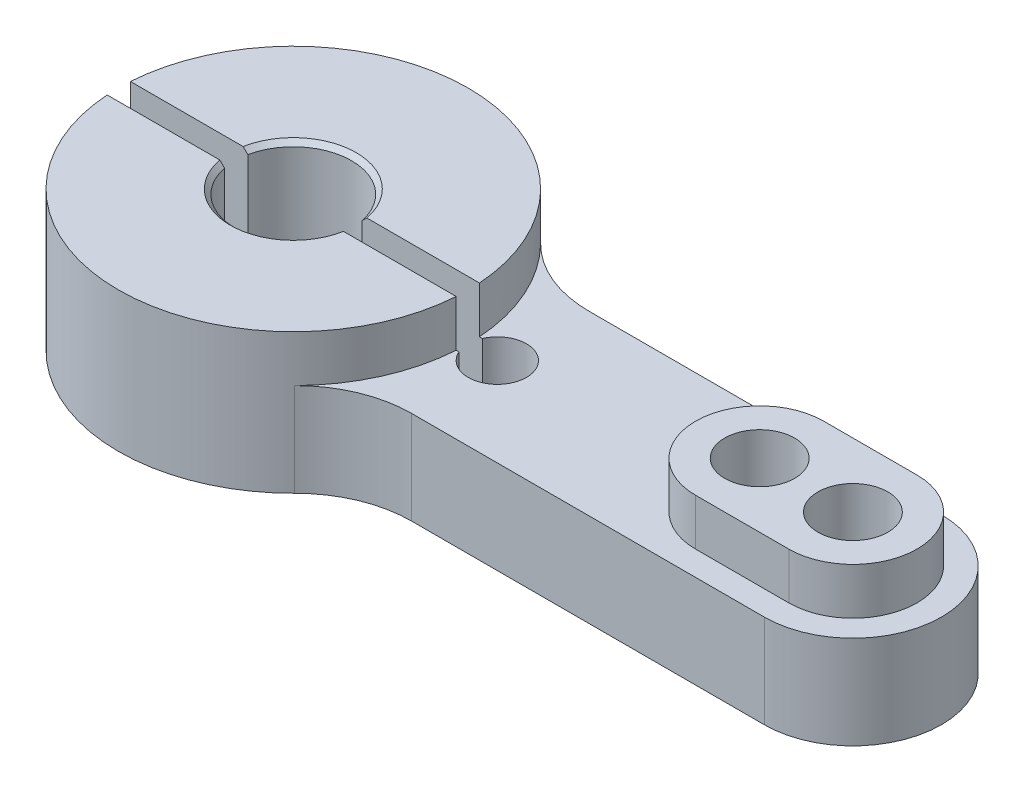
ISO-10303-21;
HEADER;
FILE_DESCRIPTION(('STEP AP214'),'2;1');
FILE_NAME('part.step','',(''),(''),'','','');
FILE_SCHEMA(('AUTOMOTIVE_DESIGN { 1 0 10303 214 1 1 1 1 }'));
ENDSEC;
DATA;
#1=APPLICATION_CONTEXT('core data for automotive mechanical design processes');
#2=APPLICATION_PROTOCOL_DEFINITION('international standard','automotive_design',2000,#1);
#3=PRODUCT_CONTEXT('',#1,'mechanical');
#4=PRODUCT('Part','Part','',(#3));
#5=PRODUCT_RELATED_PRODUCT_CATEGORY('part','',(#4));
#6=PRODUCT_DEFINITION_FORMATION('','',#4);
#7=PRODUCT_DEFINITION_CONTEXT('part definition',#1,'design');
#8=PRODUCT_DEFINITION('design','',#6,#7);
#9=PRODUCT_DEFINITION_SHAPE('','',#8);
#10=(LENGTH_UNIT() NAMED_UNIT(*) SI_UNIT(.MILLI.,.METRE.));
#11=(NAMED_UNIT(*) PLANE_ANGLE_UNIT() SI_UNIT($,.RADIAN.));
#12=(NAMED_UNIT(*) SI_UNIT($,.STERADIAN.) SOLID_ANGLE_UNIT());
#13=UNCERTAINTY_MEASURE_WITH_UNIT(LENGTH_MEASURE(1.E-05),#10,'distance_accuracy_value','');
#14=(GEOMETRIC_REPRESENTATION_CONTEXT(3) GLOBAL_UNCERTAINTY_ASSIGNED_CONTEXT((#13)) GLOBAL_UNIT_ASSIGNED_CONTEXT((#10,
#11,#12)) REPRESENTATION_CONTEXT('',''));
#15=CARTESIAN_POINT('',(0.,0.,0.));
#16=DIRECTION('',(0.,0.,1.));
#17=DIRECTION('',(1.,0.,0.));
#18=AXIS2_PLACEMENT_3D('',#15,#16,#17);
#19=CARTESIAN_POINT('',(8.87749964798648,4.,8.8));
#20=DIRECTION('',(0.,-1.,0.));
#21=DIRECTION('',(0.,0.,-1.));
#22=AXIS2_PLACEMENT_3D('',#19,#20,#21);
#23=CYLINDRICAL_SURFACE('',#22,5.);
#24=DIRECTION('',(0.,-1.,0.));
#25=VECTOR('',#24,1.);
#26=CARTESIAN_POINT('',(5.32649978879189,4.,5.28));
#27=LINE('',#26,#25);
#28=CARTESIAN_POINT('',(5.32649978879188,0.,5.28000000000001));
#29=VERTEX_POINT('',#28);
#30=CARTESIAN_POINT('',(5.32649978879189,4.,5.28));
#31=VERTEX_POINT('',#30);
#32=EDGE_CURVE('E443',#29,#31,#27,.F.);
#33=ORIENTED_EDGE('',*,*,#32,.F.);
#34=CARTESIAN_POINT('',(8.87749964798648,0.,8.8));
#35=DIRECTION('',(0.,1.,0.));
#36=DIRECTION('',(0.,0.,1.));
#37=AXIS2_PLACEMENT_3D('',#34,#35,#36);
#38=CIRCLE('',#37,5.);
#39=CARTESIAN_POINT('',(8.87749964798648,0.,3.8));
#40=VERTEX_POINT('',#39);
#41=EDGE_CURVE('E449',#29,#40,#38,.F.);
#42=ORIENTED_EDGE('',*,*,#41,.T.);
#43=DIRECTION('',(0.,-1.,0.));
#44=VECTOR('',#43,1.);
#45=CARTESIAN_POINT('',(8.87749964798648,4.,3.8));
#46=LINE('',#45,#44);
#47=CARTESIAN_POINT('',(8.87749964798648,4.,3.8));
#48=VERTEX_POINT('',#47);
#49=EDGE_CURVE('E446',#48,#40,#46,.T.);
#50=ORIENTED_EDGE('',*,*,#49,.F.);
#51=CARTESIAN_POINT('',(8.87749964798648,4.,8.8));
#52=DIRECTION('',(0.,1.,0.));
#53=DIRECTION('',(0.,0.,1.));
#54=AXIS2_PLACEMENT_3D('',#51,#52,#53);
#55=CIRCLE('',#54,5.);
#56=EDGE_CURVE('E451',#48,#31,#55,.T.);
#57=ORIENTED_EDGE('',*,*,#56,.T.);
#58=EDGE_LOOP('',(#33,#42,#50,#57));
#59=FACE_BOUND('',#58,.T.);
#60=ADVANCED_FACE('F36',(#59),#23,.F.);
#61=CARTESIAN_POINT('',(8.87749964798648,4.,-8.8));
#62=DIRECTION('',(0.,-1.,0.));
#63=DIRECTION('',(0.,0.,-1.));
#64=AXIS2_PLACEMENT_3D('',#61,#62,#63);
#65=CYLINDRICAL_SURFACE('',#64,5.);
#66=DIRECTION('',(0.,-1.,0.));
#67=VECTOR('',#66,1.);
#68=CARTESIAN_POINT('',(5.32649978879189,4.,-5.28));
#69=LINE('',#68,#67);
#70=CARTESIAN_POINT('',(5.32649978879189,4.,-5.28));
#71=VERTEX_POINT('',#70);
#72=CARTESIAN_POINT('',(5.32649978879189,0.,-5.28));
#73=VERTEX_POINT('',#72);
#74=EDGE_CURVE('E245',#71,#73,#69,.T.);
#75=ORIENTED_EDGE('',*,*,#74,.F.);
#76=CARTESIAN_POINT('',(8.87749964798648,4.,-8.8));
#77=DIRECTION('',(0.,1.,0.));
#78=DIRECTION('',(0.,0.,1.));
#79=AXIS2_PLACEMENT_3D('',#76,#77,#78);
#80=CIRCLE('',#79,5.);
#81=CARTESIAN_POINT('',(8.87749964798648,4.,-3.8));
#82=VERTEX_POINT('',#81);
#83=EDGE_CURVE('E439',#71,#82,#80,.T.);
#84=ORIENTED_EDGE('',*,*,#83,.T.);
#85=DIRECTION('',(0.,1.,0.));
#86=VECTOR('',#85,1.);
#87=CARTESIAN_POINT('',(8.87749964798648,4.,-3.8));
#88=LINE('',#87,#86);
#89=CARTESIAN_POINT('',(8.87749964798648,0.,-3.8));
#90=VERTEX_POINT('',#89);
#91=EDGE_CURVE('E436',#90,#82,#88,.T.);
#92=ORIENTED_EDGE('',*,*,#91,.F.);
#93=CARTESIAN_POINT('',(8.87749964798648,0.,-8.8));
#94=DIRECTION('',(0.,1.,0.));
#95=DIRECTION('',(0.,0.,1.));
#96=AXIS2_PLACEMENT_3D('',#93,#94,#95);
#97=CIRCLE('',#96,5.);
#98=EDGE_CURVE('E441',#90,#73,#97,.F.);
#99=ORIENTED_EDGE('',*,*,#98,.T.);
#100=EDGE_LOOP('',(#75,#84,#92,#99));
#101=FACE_BOUND('',#100,.T.);
#102=ADVANCED_FACE('F563',(#101),#65,.F.);
#103=CARTESIAN_POINT('',(0.,6.,0.));
#104=DIRECTION('',(0.,-1.,0.));
#105=DIRECTION('',(0.,0.,-1.));
#106=AXIS2_PLACEMENT_3D('',#103,#104,#105);
#107=CYLINDRICAL_SURFACE('',#106,1.);
#108=CARTESIAN_POINT('',(0.,1.,0.));
#109=DIRECTION('',(0.,-1.,0.));
#110=DIRECTION('',(0.,0.,-1.));
#111=AXIS2_PLACEMENT_3D('',#108,#109,#110);
#112=CIRCLE('',#111,1.);
#113=CARTESIAN_POINT('',(0.866025403784439,1.,-0.5));
#114=VERTEX_POINT('',#113);
#115=CARTESIAN_POINT('',(-0.866025403784439,1.,-0.5));
#116=VERTEX_POINT('',#115);
#117=EDGE_CURVE('E421',#114,#116,#112,.F.);
#118=ORIENTED_EDGE('',*,*,#117,.F.);
#119=DIRECTION('',(0.,-1.,0.));
#120=VECTOR('',#119,1.);
#121=CARTESIAN_POINT('',(0.866025403784439,6.,-0.5));
#122=LINE('',#121,#120);
#123=CARTESIAN_POINT('',(0.866025403784439,2.,-0.5));
#124=VERTEX_POINT('',#123);
#125=EDGE_CURVE('E317',#114,#124,#122,.F.);
#126=ORIENTED_EDGE('',*,*,#125,.T.);
#127=CARTESIAN_POINT('',(0.,2.,0.));
#128=DIRECTION('',(0.,1.,0.));
#129=DIRECTION('',(0.,0.,1.));
#130=AXIS2_PLACEMENT_3D('',#127,#128,#129);
#131=CIRCLE('',#130,1.);
#132=CARTESIAN_POINT('',(-0.866025403784439,2.,-0.5));
#133=VERTEX_POINT('',#132);
#134=EDGE_CURVE('E339',#124,#133,#131,.T.);
#135=ORIENTED_EDGE('',*,*,#134,.T.);
#136=DIRECTION('',(0.,-1.,0.));
#137=VECTOR('',#136,1.);
#138=CARTESIAN_POINT('',(-0.866025403784439,6.,-0.5));
#139=LINE('',#138,#137);
#140=EDGE_CURVE('E307',#133,#116,#139,.T.);
#141=ORIENTED_EDGE('',*,*,#140,.T.);
#142=EDGE_LOOP('',(#118,#126,#135,#141));
#143=FACE_BOUND('',#142,.T.);
#144=ADVANCED_FACE('F565',(#143),#107,.F.);
#145=CARTESIAN_POINT('',(0.,4.,0.));
#146=DIRECTION('',(0.,-1.,0.));
#147=DIRECTION('',(0.,0.,-1.));
#148=AXIS2_PLACEMENT_3D('',#145,#146,#147);
#149=CYLINDRICAL_SURFACE('',#148,7.5);
#150=CARTESIAN_POINT('',(0.,4.,0.));
#151=DIRECTION('',(0.,1.,0.));
#152=DIRECTION('',(0.,0.,1.));
#153=AXIS2_PLACEMENT_3D('',#150,#151,#152);
#154=CIRCLE('',#153,7.5);
#155=CARTESIAN_POINT('',(7.48331477354788,4.,-0.5));
#156=VERTEX_POINT('',#155);
#157=EDGE_CURVE('E384',#156,#71,#154,.T.);
#158=ORIENTED_EDGE('',*,*,#157,.T.);
#159=ORIENTED_EDGE('',*,*,#74,.T.);
#160=CARTESIAN_POINT('',(0.,0.,0.));
#161=DIRECTION('',(0.,1.,0.));
#162=DIRECTION('',(0.,0.,1.));
#163=AXIS2_PLACEMENT_3D('',#160,#161,#162);
#164=CIRCLE('',#163,7.5);
#165=CARTESIAN_POINT('',(-7.48331477354788,0.,-0.5));
#166=VERTEX_POINT('',#165);
#167=EDGE_CURVE('E238',#73,#166,#164,.T.);
#168=ORIENTED_EDGE('',*,*,#167,.T.);
#169=DIRECTION('',(0.,-1.,0.));
#170=VECTOR('',#169,1.);
#171=CARTESIAN_POINT('',(-7.48331477354788,4.,-0.5));
#172=LINE('',#171,#170);
#173=CARTESIAN_POINT('',(-7.48331477354788,6.,-0.5));
#174=VERTEX_POINT('',#173);
#175=EDGE_CURVE('E242',#166,#174,#172,.F.);
#176=ORIENTED_EDGE('',*,*,#175,.T.);
#177=CARTESIAN_POINT('',(0.,6.,0.));
#178=DIRECTION('',(0.,1.,0.));
#179=DIRECTION('',(0.,0.,1.));
#180=AXIS2_PLACEMENT_3D('',#177,#178,#179);
#181=CIRCLE('',#180,7.5);
#182=CARTESIAN_POINT('',(7.48331477354788,6.,-0.5));
#183=VERTEX_POINT('',#182);
#184=EDGE_CURVE('E381',#183,#174,#181,.T.);
#185=ORIENTED_EDGE('',*,*,#184,.F.);
#186=DIRECTION('',(0.,-1.,0.));
#187=VECTOR('',#186,1.);
#188=CARTESIAN_POINT('',(7.48331477354788,4.,-0.5));
#189=LINE('',#188,#187);
#190=EDGE_CURVE('E259',#183,#156,#189,.T.);
#191=ORIENTED_EDGE('',*,*,#190,.T.);
#192=EDGE_LOOP('',(#158,#159,#168,#176,#185,#191));
#193=FACE_BOUND('',#192,.T.);
#194=ADVANCED_FACE('F240',(#193),#149,.T.);
#195=CARTESIAN_POINT('',(0.,6.,0.));
#196=DIRECTION('',(0.,1.,0.));
#197=DIRECTION('',(0.,0.,1.));
#198=AXIS2_PLACEMENT_3D('',#195,#196,#197);
#199=PLANE('',#198);
#200=DIRECTION('',(1.,0.,0.));
#201=VECTOR('',#200,1.);
#202=CARTESIAN_POINT('',(-10.3852260103908,6.,-0.5));
#203=LINE('',#202,#201);
#204=CARTESIAN_POINT('',(-2.65329983228432,6.,-0.5));
#205=VERTEX_POINT('',#204);
#206=EDGE_CURVE('E257',#174,#205,#203,.T.);
#207=ORIENTED_EDGE('',*,*,#206,.T.);
#208=CARTESIAN_POINT('',(0.,6.,0.));
#209=DIRECTION('',(0.,1.,0.));
#210=DIRECTION('',(0.,0.,1.));
#211=AXIS2_PLACEMENT_3D('',#208,#209,#210);
#212=CIRCLE('',#211,2.7);
#213=CARTESIAN_POINT('',(2.65329983228432,6.,-0.5));
#214=VERTEX_POINT('',#213);
#215=EDGE_CURVE('E464',#205,#214,#212,.F.);
#216=ORIENTED_EDGE('',*,*,#215,.T.);
#217=EDGE_CURVE('E540',#214,#183,#203,.T.);
#218=ORIENTED_EDGE('',*,*,#217,.T.);
#219=ORIENTED_EDGE('',*,*,#184,.T.);
#220=EDGE_LOOP('',(#207,#216,#218,#219));
#221=FACE_BOUND('',#220,.T.);
#222=ADVANCED_FACE('F538',(#221),#199,.T.);
#223=CARTESIAN_POINT('',(0.,2.,0.));
#224=DIRECTION('',(0.,1.,0.));
#225=DIRECTION('',(0.,0.,1.));
#226=AXIS2_PLACEMENT_3D('',#223,#224,#225);
#227=CYLINDRICAL_SURFACE('',#226,2.5);
#228=DIRECTION('',(0.,1.,0.));
#229=VECTOR('',#228,1.);
#230=CARTESIAN_POINT('',(2.44948974278318,2.,-0.5));
#231=LINE('',#230,#229);
#232=CARTESIAN_POINT('',(2.44948974278318,2.,-0.5));
#233=VERTEX_POINT('',#232);
#234=CARTESIAN_POINT('',(2.44948974278318,5.8,-0.5));
#235=VERTEX_POINT('',#234);
#236=EDGE_CURVE('E320',#233,#235,#231,.T.);
#237=ORIENTED_EDGE('',*,*,#236,.T.);
#238=CARTESIAN_POINT('',(0.,5.8,0.));
#239=DIRECTION('',(0.,1.,0.));
#240=DIRECTION('',(0.,0.,1.));
#241=AXIS2_PLACEMENT_3D('',#238,#239,#240);
#242=CIRCLE('',#241,2.5);
#243=CARTESIAN_POINT('',(-2.44948974278318,5.8,-0.5));
#244=VERTEX_POINT('',#243);
#245=EDGE_CURVE('E454',#235,#244,#242,.T.);
#246=ORIENTED_EDGE('',*,*,#245,.T.);
#247=DIRECTION('',(0.,1.,0.));
#248=VECTOR('',#247,1.);
#249=CARTESIAN_POINT('',(-2.44948974278318,2.,-0.5));
#250=LINE('',#249,#248);
#251=CARTESIAN_POINT('',(-2.44948974278318,2.,-0.5));
#252=VERTEX_POINT('',#251);
#253=EDGE_CURVE('E314',#244,#252,#250,.F.);
#254=ORIENTED_EDGE('',*,*,#253,.T.);
#255=CARTESIAN_POINT('',(0.,2.,0.));
#256=DIRECTION('',(0.,1.,0.));
#257=DIRECTION('',(0.,0.,1.));
#258=AXIS2_PLACEMENT_3D('',#255,#256,#257);
#259=CIRCLE('',#258,2.5);
#260=EDGE_CURVE('E338',#233,#252,#259,.T.);
#261=ORIENTED_EDGE('',*,*,#260,.F.);
#262=EDGE_LOOP('',(#237,#246,#254,#261));
#263=FACE_BOUND('',#262,.T.);
#264=ADVANCED_FACE('F620',(#263),#227,.F.);
#265=CARTESIAN_POINT('',(0.,2.,0.));
#266=DIRECTION('',(0.,1.,0.));
#267=DIRECTION('',(0.,0.,1.));
#268=AXIS2_PLACEMENT_3D('',#265,#266,#267);
#269=PLANE('',#268);
#270=DIRECTION('',(-1.,0.,0.));
#271=VECTOR('',#270,1.);
#272=CARTESIAN_POINT('',(0.,2.,-0.5));
#273=LINE('',#272,#271);
#274=EDGE_CURVE('E315',#233,#124,#273,.T.);
#275=ORIENTED_EDGE('',*,*,#274,.F.);
#276=ORIENTED_EDGE('',*,*,#260,.T.);
#277=EDGE_CURVE('E311',#133,#252,#273,.T.);
#278=ORIENTED_EDGE('',*,*,#277,.F.);
#279=ORIENTED_EDGE('',*,*,#134,.F.);
#280=EDGE_LOOP('',(#275,#276,#278,#279));
#281=FACE_BOUND('',#280,.T.);
#282=ADVANCED_FACE('F622',(#281),#269,.T.);
#283=CARTESIAN_POINT('',(0.,1.,0.));
#284=DIRECTION('',(0.,-1.,0.));
#285=DIRECTION('',(0.,0.,-1.));
#286=AXIS2_PLACEMENT_3D('',#283,#284,#285);
#287=PLANE('',#286);
#288=DIRECTION('',(1.,0.,0.));
#289=VECTOR('',#288,1.);
#290=CARTESIAN_POINT('',(0.,1.,-0.5));
#291=LINE('',#290,#289);
#292=CARTESIAN_POINT('',(-3.71651718682963,1.,-0.5));
#293=VERTEX_POINT('',#292);
#294=EDGE_CURVE('E305',#293,#116,#291,.T.);
#295=ORIENTED_EDGE('',*,*,#294,.F.);
#296=CARTESIAN_POINT('',(0.,1.,0.));
#297=DIRECTION('',(0.,-1.,0.));
#298=DIRECTION('',(0.,0.,-1.));
#299=AXIS2_PLACEMENT_3D('',#296,#297,#298);
#300=CIRCLE('',#299,3.75);
#301=CARTESIAN_POINT('',(3.71651718682963,1.,-0.5));
#302=VERTEX_POINT('',#301);
#303=EDGE_CURVE('E329',#293,#302,#300,.T.);
#304=ORIENTED_EDGE('',*,*,#303,.T.);
#305=EDGE_CURVE('E308',#114,#302,#291,.T.);
#306=ORIENTED_EDGE('',*,*,#305,.F.);
#307=ORIENTED_EDGE('',*,*,#117,.T.);
#308=EDGE_LOOP('',(#295,#304,#306,#307));
#309=FACE_BOUND('',#308,.T.);
#310=ADVANCED_FACE('F628',(#309),#287,.T.);
#311=CARTESIAN_POINT('',(0.,1.,0.));
#312=DIRECTION('',(0.,-1.,0.));
#313=DIRECTION('',(0.,0.,-1.));
#314=AXIS2_PLACEMENT_3D('',#311,#312,#313);
#315=CYLINDRICAL_SURFACE('',#314,3.75);
#316=CARTESIAN_POINT('',(0.,0.,0.));
#317=DIRECTION('',(0.,-1.,0.));
#318=DIRECTION('',(0.,0.,-1.));
#319=AXIS2_PLACEMENT_3D('',#316,#317,#318);
#320=CIRCLE('',#319,3.75);
#321=CARTESIAN_POINT('',(-3.71651718682963,0.,-0.5));
#322=VERTEX_POINT('',#321);
#323=CARTESIAN_POINT('',(3.71651718682963,0.,-0.5));
#324=VERTEX_POINT('',#323);
#325=EDGE_CURVE('E258',#322,#324,#320,.T.);
#326=ORIENTED_EDGE('',*,*,#325,.T.);
#327=DIRECTION('',(0.,-1.,0.));
#328=VECTOR('',#327,1.);
#329=CARTESIAN_POINT('',(3.71651718682963,1.,-0.5));
#330=LINE('',#329,#328);
#331=EDGE_CURVE('E432',#324,#302,#330,.F.);
#332=ORIENTED_EDGE('',*,*,#331,.T.);
#333=ORIENTED_EDGE('',*,*,#303,.F.);
#334=DIRECTION('',(0.,-1.,0.));
#335=VECTOR('',#334,1.);
#336=CARTESIAN_POINT('',(-3.71651718682963,1.,-0.5));
#337=LINE('',#336,#335);
#338=EDGE_CURVE('E430',#293,#322,#337,.T.);
#339=ORIENTED_EDGE('',*,*,#338,.T.);
#340=EDGE_LOOP('',(#326,#332,#333,#339));
#341=FACE_BOUND('',#340,.T.);
#342=ADVANCED_FACE('F625',(#341),#315,.F.);
#343=CARTESIAN_POINT('',(-0.866025403784439,1.,0.5));
#344=VERTEX_POINT('',#343);
#345=CARTESIAN_POINT('',(0.866025403784439,1.,0.5));
#346=VERTEX_POINT('',#345);
#347=EDGE_CURVE('E420',#344,#346,#112,.F.);
#348=ORIENTED_EDGE('',*,*,#347,.F.);
#349=DIRECTION('',(0.,-1.,0.));
#350=VECTOR('',#349,1.);
#351=CARTESIAN_POINT('',(-0.866025403784439,6.,0.5));
#352=LINE('',#351,#350);
#353=CARTESIAN_POINT('',(-0.866025403784439,2.,0.5));
#354=VERTEX_POINT('',#353);
#355=EDGE_CURVE('E289',#344,#354,#352,.F.);
#356=ORIENTED_EDGE('',*,*,#355,.T.);
#357=CARTESIAN_POINT('',(0.866025403784439,2.,0.5));
#358=VERTEX_POINT('',#357);
#359=EDGE_CURVE('E417',#354,#358,#131,.T.);
#360=ORIENTED_EDGE('',*,*,#359,.T.);
#361=DIRECTION('',(0.,-1.,0.));
#362=VECTOR('',#361,1.);
#363=CARTESIAN_POINT('',(0.866025403784439,6.,0.5));
#364=LINE('',#363,#362);
#365=EDGE_CURVE('E279',#358,#346,#364,.T.);
#366=ORIENTED_EDGE('',*,*,#365,.T.);
#367=EDGE_LOOP('',(#348,#356,#360,#366));
#368=FACE_BOUND('',#367,.T.);
#369=ADVANCED_FACE('F505',(#368),#107,.F.);
#370=CARTESIAN_POINT('',(-7.48331477354788,0.,0.5));
#371=VERTEX_POINT('',#370);
#372=EDGE_CURVE('E249',#371,#29,#164,.T.);
#373=ORIENTED_EDGE('',*,*,#372,.T.);
#374=ORIENTED_EDGE('',*,*,#32,.T.);
#375=CARTESIAN_POINT('',(7.48331477354788,4.,0.5));
#376=VERTEX_POINT('',#375);
#377=EDGE_CURVE('E377',#31,#376,#154,.T.);
#378=ORIENTED_EDGE('',*,*,#377,.T.);
#379=DIRECTION('',(0.,-1.,0.));
#380=VECTOR('',#379,1.);
#381=CARTESIAN_POINT('',(7.48331477354788,4.,0.5));
#382=LINE('',#381,#380);
#383=CARTESIAN_POINT('',(7.48331477354788,6.,0.5));
#384=VERTEX_POINT('',#383);
#385=EDGE_CURVE('E299',#376,#384,#382,.F.);
#386=ORIENTED_EDGE('',*,*,#385,.T.);
#387=CARTESIAN_POINT('',(-7.48331477354788,6.,0.5));
#388=VERTEX_POINT('',#387);
#389=EDGE_CURVE('E378',#388,#384,#181,.T.);
#390=ORIENTED_EDGE('',*,*,#389,.F.);
#391=DIRECTION('',(0.,-1.,0.));
#392=VECTOR('',#391,1.);
#393=CARTESIAN_POINT('',(-7.48331477354788,4.,0.5));
#394=LINE('',#393,#392);
#395=EDGE_CURVE('E302',#388,#371,#394,.T.);
#396=ORIENTED_EDGE('',*,*,#395,.T.);
#397=EDGE_LOOP('',(#373,#374,#378,#386,#390,#396));
#398=FACE_BOUND('',#397,.T.);
#399=ADVANCED_FACE('F545',(#398),#149,.T.);
#400=CARTESIAN_POINT('',(0.,4.,3.8));
#401=DIRECTION('',(0.,0.,1.));
#402=DIRECTION('',(1.,0.,0.));
#403=AXIS2_PLACEMENT_3D('',#400,#401,#402);
#404=PLANE('',#403);
#405=DIRECTION('',(-1.,0.,0.));
#406=VECTOR('',#405,1.);
#407=CARTESIAN_POINT('',(0.,4.,3.8));
#408=LINE('',#407,#406);
#409=CARTESIAN_POINT('',(24.,4.,3.8));
#410=VERTEX_POINT('',#409);
#411=EDGE_CURVE('E388',#410,#48,#408,.T.);
#412=ORIENTED_EDGE('',*,*,#411,.T.);
#413=ORIENTED_EDGE('',*,*,#49,.T.);
#414=DIRECTION('',(-1.,0.,0.));
#415=VECTOR('',#414,1.);
#416=CARTESIAN_POINT('',(0.,0.,3.8));
#417=LINE('',#416,#415);
#418=CARTESIAN_POINT('',(24.,0.,3.8));
#419=VERTEX_POINT('',#418);
#420=EDGE_CURVE('E248',#419,#40,#417,.T.);
#421=ORIENTED_EDGE('',*,*,#420,.F.);
#422=DIRECTION('',(0.,-1.,0.));
#423=VECTOR('',#422,1.);
#424=CARTESIAN_POINT('',(24.,4.,3.8));
#425=LINE('',#424,#423);
#426=EDGE_CURVE('E415',#410,#419,#425,.T.);
#427=ORIENTED_EDGE('',*,*,#426,.F.);
#428=EDGE_LOOP('',(#412,#413,#421,#427));
#429=FACE_BOUND('',#428,.T.);
#430=ADVANCED_FACE('F552',(#429),#404,.T.);
#431=CARTESIAN_POINT('',(24.,4.,0.));
#432=DIRECTION('',(0.,-1.,0.));
#433=DIRECTION('',(0.,0.,-1.));
#434=AXIS2_PLACEMENT_3D('',#431,#432,#433);
#435=CYLINDRICAL_SURFACE('',#434,3.8);
#436=CARTESIAN_POINT('',(24.,0.,0.));
#437=DIRECTION('',(0.,1.,0.));
#438=DIRECTION('',(0.,0.,1.));
#439=AXIS2_PLACEMENT_3D('',#436,#437,#438);
#440=CIRCLE('',#439,3.8);
#441=CARTESIAN_POINT('',(24.,0.,-3.8));
#442=VERTEX_POINT('',#441);
#443=EDGE_CURVE('E403',#442,#419,#440,.F.);
#444=ORIENTED_EDGE('',*,*,#443,.F.);
#445=DIRECTION('',(0.,-1.,0.));
#446=VECTOR('',#445,1.);
#447=CARTESIAN_POINT('',(24.,4.,-3.8));
#448=LINE('',#447,#446);
#449=CARTESIAN_POINT('',(24.,4.,-3.8));
#450=VERTEX_POINT('',#449);
#451=EDGE_CURVE('E398',#450,#442,#448,.T.);
#452=ORIENTED_EDGE('',*,*,#451,.F.);
#453=CARTESIAN_POINT('',(24.,4.,0.));
#454=DIRECTION('',(0.,1.,0.));
#455=DIRECTION('',(0.,0.,1.));
#456=AXIS2_PLACEMENT_3D('',#453,#454,#455);
#457=CIRCLE('',#456,3.8);
#458=EDGE_CURVE('E392',#450,#410,#457,.F.);
#459=ORIENTED_EDGE('',*,*,#458,.T.);
#460=ORIENTED_EDGE('',*,*,#426,.T.);
#461=EDGE_LOOP('',(#444,#452,#459,#460));
#462=FACE_BOUND('',#461,.T.);
#463=ADVANCED_FACE('F556',(#462),#435,.T.);
#464=CARTESIAN_POINT('',(24.,4.,0.));
#465=DIRECTION('',(0.,-1.,0.));
#466=DIRECTION('',(0.,0.,-1.));
#467=AXIS2_PLACEMENT_3D('',#464,#465,#466);
#468=CYLINDRICAL_SURFACE('',#467,1.5);
#469=CARTESIAN_POINT('',(24.,0.,0.));
#470=DIRECTION('',(0.,1.,0.));
#471=DIRECTION('',(0.,0.,1.));
#472=AXIS2_PLACEMENT_3D('',#469,#470,#471);
#473=CIRCLE('',#472,1.5);
#474=CARTESIAN_POINT('',(24.,0.,1.5));
#475=VERTEX_POINT('',#474);
#476=EDGE_CURVE('E409',#475,#475,#473,.T.);
#477=ORIENTED_EDGE('',*,*,#476,.F.);
#478=EDGE_LOOP('',(#477));
#479=FACE_BOUND('',#478,.T.);
#480=CARTESIAN_POINT('',(24.,6.,0.));
#481=DIRECTION('',(0.,1.,0.));
#482=DIRECTION('',(0.,0.,1.));
#483=AXIS2_PLACEMENT_3D('',#480,#481,#482);
#484=CIRCLE('',#483,1.5);
#485=CARTESIAN_POINT('',(24.,6.,1.5));
#486=VERTEX_POINT('',#485);
#487=EDGE_CURVE('E354',#486,#486,#484,.F.);
#488=ORIENTED_EDGE('',*,*,#487,.F.);
#489=EDGE_LOOP('',(#488));
#490=FACE_BOUND('',#489,.T.);
#491=ADVANCED_FACE('F583',(#479,#490),#468,.F.);
#492=CARTESIAN_POINT('',(0.,4.,-3.8));
#493=DIRECTION('',(0.,0.,1.));
#494=DIRECTION('',(1.,0.,0.));
#495=AXIS2_PLACEMENT_3D('',#492,#493,#494);
#496=PLANE('',#495);
#497=DIRECTION('',(-1.,0.,0.));
#498=VECTOR('',#497,1.);
#499=CARTESIAN_POINT('',(0.,0.,-3.8));
#500=LINE('',#499,#498);
#501=EDGE_CURVE('E406',#442,#90,#500,.T.);
#502=ORIENTED_EDGE('',*,*,#501,.T.);
#503=ORIENTED_EDGE('',*,*,#91,.T.);
#504=DIRECTION('',(-1.,0.,0.));
#505=VECTOR('',#504,1.);
#506=CARTESIAN_POINT('',(0.,4.,-3.8));
#507=LINE('',#506,#505);
#508=EDGE_CURVE('E395',#450,#82,#507,.T.);
#509=ORIENTED_EDGE('',*,*,#508,.F.);
#510=ORIENTED_EDGE('',*,*,#451,.T.);
#511=EDGE_LOOP('',(#502,#503,#509,#510));
#512=FACE_BOUND('',#511,.T.);
#513=ADVANCED_FACE('F560',(#512),#496,.F.);
#514=CARTESIAN_POINT('',(8.75,4.,0.));
#515=DIRECTION('',(0.,-1.,0.));
#516=DIRECTION('',(0.,0.,-1.));
#517=AXIS2_PLACEMENT_3D('',#514,#515,#516);
#518=CYLINDRICAL_SURFACE('',#517,1.25);
#519=DIRECTION('',(0.,-1.,0.));
#520=VECTOR('',#519,1.);
#521=CARTESIAN_POINT('',(7.60435607626104,4.,-0.5));
#522=LINE('',#521,#520);
#523=CARTESIAN_POINT('',(7.60435607626104,0.,-0.5));
#524=VERTEX_POINT('',#523);
#525=CARTESIAN_POINT('',(7.60435607626104,4.,-0.5));
#526=VERTEX_POINT('',#525);
#527=EDGE_CURVE('E325',#524,#526,#522,.F.);
#528=ORIENTED_EDGE('',*,*,#527,.F.);
#529=CARTESIAN_POINT('',(8.75,0.,0.));
#530=DIRECTION('',(0.,1.,0.));
#531=DIRECTION('',(0.,0.,1.));
#532=AXIS2_PLACEMENT_3D('',#529,#530,#531);
#533=CIRCLE('',#532,1.25);
#534=CARTESIAN_POINT('',(7.60435607626104,0.,0.5));
#535=VERTEX_POINT('',#534);
#536=EDGE_CURVE('E399',#535,#524,#533,.T.);
#537=ORIENTED_EDGE('',*,*,#536,.F.);
#538=DIRECTION('',(0.,-1.,0.));
#539=VECTOR('',#538,1.);
#540=CARTESIAN_POINT('',(7.60435607626104,4.,0.5));
#541=LINE('',#540,#539);
#542=CARTESIAN_POINT('',(7.60435607626104,4.,0.5));
#543=VERTEX_POINT('',#542);
#544=EDGE_CURVE('E297',#543,#535,#541,.T.);
#545=ORIENTED_EDGE('',*,*,#544,.F.);
#546=CARTESIAN_POINT('',(8.75,4.,0.));
#547=DIRECTION('',(0.,1.,0.));
#548=DIRECTION('',(0.,0.,1.));
#549=AXIS2_PLACEMENT_3D('',#546,#547,#548);
#550=CIRCLE('',#549,1.25);
#551=EDGE_CURVE('E385',#543,#526,#550,.T.);
#552=ORIENTED_EDGE('',*,*,#551,.T.);
#553=EDGE_LOOP('',(#528,#537,#545,#552));
#554=FACE_BOUND('',#553,.T.);
#555=ADVANCED_FACE('F527',(#554),#518,.F.);
#556=CARTESIAN_POINT('',(20.,4.,0.));
#557=DIRECTION('',(0.,-1.,0.));
#558=DIRECTION('',(0.,0.,-1.));
#559=AXIS2_PLACEMENT_3D('',#556,#557,#558);
#560=CYLINDRICAL_SURFACE('',#559,1.5);
#561=CARTESIAN_POINT('',(20.,0.,0.));
#562=DIRECTION('',(0.,1.,0.));
#563=DIRECTION('',(0.,0.,1.));
#564=AXIS2_PLACEMENT_3D('',#561,#562,#563);
#565=CIRCLE('',#564,1.5);
#566=CARTESIAN_POINT('',(20.,0.,1.5));
#567=VERTEX_POINT('',#566);
#568=EDGE_CURVE('E389',#567,#567,#565,.T.);
#569=ORIENTED_EDGE('',*,*,#568,.F.);
#570=EDGE_LOOP('',(#569));
#571=FACE_BOUND('',#570,.T.);
#572=CARTESIAN_POINT('',(20.,6.,0.));
#573=DIRECTION('',(0.,1.,0.));
#574=DIRECTION('',(0.,0.,1.));
#575=AXIS2_PLACEMENT_3D('',#572,#573,#574);
#576=CIRCLE('',#575,1.5);
#577=CARTESIAN_POINT('',(20.,6.,1.5));
#578=VERTEX_POINT('',#577);
#579=EDGE_CURVE('E351',#578,#578,#576,.F.);
#580=ORIENTED_EDGE('',*,*,#579,.F.);
#581=EDGE_LOOP('',(#580));
#582=FACE_BOUND('',#581,.T.);
#583=ADVANCED_FACE('F576',(#571,#582),#560,.F.);
#584=CARTESIAN_POINT('',(0.,4.,0.));
#585=DIRECTION('',(0.,1.,0.));
#586=DIRECTION('',(0.,0.,1.));
#587=AXIS2_PLACEMENT_3D('',#584,#585,#586);
#588=PLANE('',#587);
#589=DIRECTION('',(-1.,0.,0.));
#590=VECTOR('',#589,1.);
#591=CARTESIAN_POINT('',(0.,4.,-0.5));
#592=LINE('',#591,#590);
#593=EDGE_CURVE('E323',#526,#156,#592,.T.);
#594=ORIENTED_EDGE('',*,*,#593,.F.);
#595=ORIENTED_EDGE('',*,*,#551,.F.);
#596=DIRECTION('',(1.,0.,0.));
#597=VECTOR('',#596,1.);
#598=CARTESIAN_POINT('',(0.,4.,0.5));
#599=LINE('',#598,#597);
#600=EDGE_CURVE('E295',#376,#543,#599,.T.);
#601=ORIENTED_EDGE('',*,*,#600,.F.);
#602=ORIENTED_EDGE('',*,*,#377,.F.);
#603=ORIENTED_EDGE('',*,*,#56,.F.);
#604=ORIENTED_EDGE('',*,*,#411,.F.);
#605=ORIENTED_EDGE('',*,*,#458,.F.);
#606=ORIENTED_EDGE('',*,*,#508,.T.);
#607=ORIENTED_EDGE('',*,*,#83,.F.);
#608=ORIENTED_EDGE('',*,*,#157,.F.);
#609=EDGE_LOOP('',(#594,#595,#601,#602,#603,#604,#605,#606,#607,#608));
#610=FACE_BOUND('',#609,.T.);
#611=CARTESIAN_POINT('',(20.,4.,0.));
#612=DIRECTION('',(0.,1.,0.));
#613=DIRECTION('',(0.,0.,1.));
#614=AXIS2_PLACEMENT_3D('',#611,#612,#613);
#615=CIRCLE('',#614,2.75);
#616=CARTESIAN_POINT('',(20.,4.,2.75));
#617=VERTEX_POINT('',#616);
#618=CARTESIAN_POINT('',(20.,4.,-2.75));
#619=VERTEX_POINT('',#618);
#620=EDGE_CURVE('E358',#617,#619,#615,.F.);
#621=ORIENTED_EDGE('',*,*,#620,.T.);
#622=DIRECTION('',(-1.,0.,0.));
#623=VECTOR('',#622,1.);
#624=CARTESIAN_POINT('',(0.,4.,-2.75));
#625=LINE('',#624,#623);
#626=CARTESIAN_POINT('',(24.,4.,-2.75));
#627=VERTEX_POINT('',#626);
#628=EDGE_CURVE('E344',#627,#619,#625,.T.);
#629=ORIENTED_EDGE('',*,*,#628,.F.);
#630=CARTESIAN_POINT('',(24.,4.,0.));
#631=DIRECTION('',(0.,1.,0.));
#632=DIRECTION('',(0.,0.,1.));
#633=AXIS2_PLACEMENT_3D('',#630,#631,#632);
#634=CIRCLE('',#633,2.75);
#635=CARTESIAN_POINT('',(24.,4.,2.75));
#636=VERTEX_POINT('',#635);
#637=EDGE_CURVE('E364',#627,#636,#634,.F.);
#638=ORIENTED_EDGE('',*,*,#637,.T.);
#639=DIRECTION('',(1.,0.,0.));
#640=VECTOR('',#639,1.);
#641=CARTESIAN_POINT('',(0.,4.,2.75));
#642=LINE('',#641,#640);
#643=EDGE_CURVE('E361',#617,#636,#642,.T.);
#644=ORIENTED_EDGE('',*,*,#643,.F.);
#645=EDGE_LOOP('',(#621,#629,#638,#644));
#646=FACE_BOUND('',#645,.T.);
#647=ADVANCED_FACE('F530',(#610,#646),#588,.T.);
#648=CARTESIAN_POINT('',(0.,0.,0.));
#649=DIRECTION('',(0.,1.,0.));
#650=DIRECTION('',(0.,0.,1.));
#651=AXIS2_PLACEMENT_3D('',#648,#649,#650);
#652=PLANE('',#651);
#653=ORIENTED_EDGE('',*,*,#536,.T.);
#654=DIRECTION('',(1.,0.,0.));
#655=VECTOR('',#654,1.);
#656=CARTESIAN_POINT('',(-10.3852260103908,0.,-0.5));
#657=LINE('',#656,#655);
#658=EDGE_CURVE('E268',#324,#524,#657,.T.);
#659=ORIENTED_EDGE('',*,*,#658,.F.);
#660=ORIENTED_EDGE('',*,*,#325,.F.);
#661=EDGE_CURVE('E254',#166,#322,#657,.T.);
#662=ORIENTED_EDGE('',*,*,#661,.F.);
#663=ORIENTED_EDGE('',*,*,#167,.F.);
#664=ORIENTED_EDGE('',*,*,#98,.F.);
#665=ORIENTED_EDGE('',*,*,#501,.F.);
#666=ORIENTED_EDGE('',*,*,#443,.T.);
#667=ORIENTED_EDGE('',*,*,#420,.T.);
#668=ORIENTED_EDGE('',*,*,#41,.F.);
#669=ORIENTED_EDGE('',*,*,#372,.F.);
#670=DIRECTION('',(-1.,0.,0.));
#671=VECTOR('',#670,1.);
#672=CARTESIAN_POINT('',(8.75,0.,0.5));
#673=LINE('',#672,#671);
#674=CARTESIAN_POINT('',(-3.71651718682963,0.,0.5));
#675=VERTEX_POINT('',#674);
#676=EDGE_CURVE('E275',#675,#371,#673,.T.);
#677=ORIENTED_EDGE('',*,*,#676,.F.);
#678=CARTESIAN_POINT('',(3.71651718682963,0.,0.5));
#679=VERTEX_POINT('',#678);
#680=EDGE_CURVE('E333',#679,#675,#320,.T.);
#681=ORIENTED_EDGE('',*,*,#680,.F.);
#682=EDGE_CURVE('E272',#535,#679,#673,.T.);
#683=ORIENTED_EDGE('',*,*,#682,.F.);
#684=EDGE_LOOP('',(#653,#659,#660,#662,#663,#664,#665,#666,#667,#668,#669,#677,#681,#683));
#685=FACE_BOUND('',#684,.T.);
#686=ORIENTED_EDGE('',*,*,#476,.T.);
#687=EDGE_LOOP('',(#686));
#688=FACE_BOUND('',#687,.T.);
#689=ORIENTED_EDGE('',*,*,#568,.T.);
#690=EDGE_LOOP('',(#689));
#691=FACE_BOUND('',#690,.T.);
#692=ADVANCED_FACE('F263',(#685,#688,#691),#652,.F.);
#693=DIRECTION('',(-1.,0.,0.));
#694=VECTOR('',#693,1.);
#695=CARTESIAN_POINT('',(8.75,6.,0.5));
#696=LINE('',#695,#694);
#697=CARTESIAN_POINT('',(2.65329983228432,6.,0.5));
#698=VERTEX_POINT('',#697);
#699=EDGE_CURVE('E270',#384,#698,#696,.T.);
#700=ORIENTED_EDGE('',*,*,#699,.T.);
#701=CARTESIAN_POINT('',(0.,6.,0.));
#702=DIRECTION('',(0.,1.,0.));
#703=DIRECTION('',(0.,0.,1.));
#704=AXIS2_PLACEMENT_3D('',#701,#702,#703);
#705=CIRCLE('',#704,2.7);
#706=CARTESIAN_POINT('',(-2.65329983228432,6.,0.5));
#707=VERTEX_POINT('',#706);
#708=EDGE_CURVE('E50',#698,#707,#705,.F.);
#709=ORIENTED_EDGE('',*,*,#708,.T.);
#710=EDGE_CURVE('E267',#707,#388,#696,.T.);
#711=ORIENTED_EDGE('',*,*,#710,.T.);
#712=ORIENTED_EDGE('',*,*,#389,.T.);
#713=EDGE_LOOP('',(#700,#709,#711,#712));
#714=FACE_BOUND('',#713,.T.);
#715=ADVANCED_FACE('F542',(#714),#199,.T.);
#716=CARTESIAN_POINT('',(20.,6.,0.));
#717=DIRECTION('',(0.,-1.,0.));
#718=DIRECTION('',(0.,0.,-1.));
#719=AXIS2_PLACEMENT_3D('',#716,#717,#718);
#720=CYLINDRICAL_SURFACE('',#719,2.75);
#721=ORIENTED_EDGE('',*,*,#620,.F.);
#722=DIRECTION('',(0.,-1.,0.));
#723=VECTOR('',#722,1.);
#724=CARTESIAN_POINT('',(20.,6.,2.75));
#725=LINE('',#724,#723);
#726=CARTESIAN_POINT('',(20.,6.,2.75));
#727=VERTEX_POINT('',#726);
#728=EDGE_CURVE('E375',#727,#617,#725,.T.);
#729=ORIENTED_EDGE('',*,*,#728,.F.);
#730=CARTESIAN_POINT('',(20.,6.,0.));
#731=DIRECTION('',(0.,1.,0.));
#732=DIRECTION('',(0.,0.,1.));
#733=AXIS2_PLACEMENT_3D('',#730,#731,#732);
#734=CIRCLE('',#733,2.75);
#735=CARTESIAN_POINT('',(20.,6.,-2.75));
#736=VERTEX_POINT('',#735);
#737=EDGE_CURVE('E340',#727,#736,#734,.F.);
#738=ORIENTED_EDGE('',*,*,#737,.T.);
#739=DIRECTION('',(0.,-1.,0.));
#740=VECTOR('',#739,1.);
#741=CARTESIAN_POINT('',(20.,6.,-2.75));
#742=LINE('',#741,#740);
#743=EDGE_CURVE('E357',#736,#619,#742,.T.);
#744=ORIENTED_EDGE('',*,*,#743,.T.);
#745=EDGE_LOOP('',(#721,#729,#738,#744));
#746=FACE_BOUND('',#745,.T.);
#747=ADVANCED_FACE('F598',(#746),#720,.T.);
#748=CARTESIAN_POINT('',(0.,6.,2.75));
#749=DIRECTION('',(0.,0.,-1.));
#750=DIRECTION('',(-1.,0.,0.));
#751=AXIS2_PLACEMENT_3D('',#748,#749,#750);
#752=PLANE('',#751);
#753=ORIENTED_EDGE('',*,*,#643,.T.);
#754=DIRECTION('',(0.,-1.,0.));
#755=VECTOR('',#754,1.);
#756=CARTESIAN_POINT('',(24.,6.,2.75));
#757=LINE('',#756,#755);
#758=CARTESIAN_POINT('',(24.,6.,2.75));
#759=VERTEX_POINT('',#758);
#760=EDGE_CURVE('E373',#759,#636,#757,.T.);
#761=ORIENTED_EDGE('',*,*,#760,.F.);
#762=DIRECTION('',(1.,0.,0.));
#763=VECTOR('',#762,1.);
#764=CARTESIAN_POINT('',(0.,6.,2.75));
#765=LINE('',#764,#763);
#766=EDGE_CURVE('E343',#727,#759,#765,.T.);
#767=ORIENTED_EDGE('',*,*,#766,.F.);
#768=ORIENTED_EDGE('',*,*,#728,.T.);
#769=EDGE_LOOP('',(#753,#761,#767,#768));
#770=FACE_BOUND('',#769,.T.);
#771=ADVANCED_FACE('F601',(#770),#752,.F.);
#772=CARTESIAN_POINT('',(24.,6.,0.));
#773=DIRECTION('',(0.,-1.,0.));
#774=DIRECTION('',(0.,0.,-1.));
#775=AXIS2_PLACEMENT_3D('',#772,#773,#774);
#776=CYLINDRICAL_SURFACE('',#775,2.75);
#777=ORIENTED_EDGE('',*,*,#637,.F.);
#778=DIRECTION('',(0.,-1.,0.));
#779=VECTOR('',#778,1.);
#780=CARTESIAN_POINT('',(24.,6.,-2.75));
#781=LINE('',#780,#779);
#782=CARTESIAN_POINT('',(24.,6.,-2.75));
#783=VERTEX_POINT('',#782);
#784=EDGE_CURVE('E370',#783,#627,#781,.T.);
#785=ORIENTED_EDGE('',*,*,#784,.F.);
#786=CARTESIAN_POINT('',(24.,6.,0.));
#787=DIRECTION('',(0.,1.,0.));
#788=DIRECTION('',(0.,0.,1.));
#789=AXIS2_PLACEMENT_3D('',#786,#787,#788);
#790=CIRCLE('',#789,2.75);
#791=EDGE_CURVE('E346',#783,#759,#790,.F.);
#792=ORIENTED_EDGE('',*,*,#791,.T.);
#793=ORIENTED_EDGE('',*,*,#760,.T.);
#794=EDGE_LOOP('',(#777,#785,#792,#793));
#795=FACE_BOUND('',#794,.T.);
#796=ADVANCED_FACE('F605',(#795),#776,.T.);
#797=CARTESIAN_POINT('',(0.,6.,-2.75));
#798=DIRECTION('',(0.,0.,1.));
#799=DIRECTION('',(1.,0.,0.));
#800=AXIS2_PLACEMENT_3D('',#797,#798,#799);
#801=PLANE('',#800);
#802=ORIENTED_EDGE('',*,*,#628,.T.);
#803=ORIENTED_EDGE('',*,*,#743,.F.);
#804=DIRECTION('',(-1.,0.,0.));
#805=VECTOR('',#804,1.);
#806=CARTESIAN_POINT('',(0.,6.,-2.75));
#807=LINE('',#806,#805);
#808=EDGE_CURVE('E349',#783,#736,#807,.T.);
#809=ORIENTED_EDGE('',*,*,#808,.F.);
#810=ORIENTED_EDGE('',*,*,#784,.T.);
#811=EDGE_LOOP('',(#802,#803,#809,#810));
#812=FACE_BOUND('',#811,.T.);
#813=ADVANCED_FACE('F609',(#812),#801,.F.);
#814=CARTESIAN_POINT('',(0.,6.,0.));
#815=DIRECTION('',(0.,1.,0.));
#816=DIRECTION('',(0.,0.,1.));
#817=AXIS2_PLACEMENT_3D('',#814,#815,#816);
#818=PLANE('',#817);
#819=ORIENTED_EDGE('',*,*,#737,.F.);
#820=ORIENTED_EDGE('',*,*,#766,.T.);
#821=ORIENTED_EDGE('',*,*,#791,.F.);
#822=ORIENTED_EDGE('',*,*,#808,.T.);
#823=EDGE_LOOP('',(#819,#820,#821,#822));
#824=FACE_BOUND('',#823,.T.);
#825=ORIENTED_EDGE('',*,*,#579,.T.);
#826=EDGE_LOOP('',(#825));
#827=FACE_BOUND('',#826,.T.);
#828=ORIENTED_EDGE('',*,*,#487,.T.);
#829=EDGE_LOOP('',(#828));
#830=FACE_BOUND('',#829,.T.);
#831=ADVANCED_FACE('F613',(#824,#827,#830),#818,.T.);
#832=DIRECTION('',(0.,1.,0.));
#833=VECTOR('',#832,1.);
#834=CARTESIAN_POINT('',(-2.44948974278318,2.,0.5));
#835=LINE('',#834,#833);
#836=CARTESIAN_POINT('',(-2.44948974278318,2.,0.5));
#837=VERTEX_POINT('',#836);
#838=CARTESIAN_POINT('',(-2.44948974278318,5.8,0.5));
#839=VERTEX_POINT('',#838);
#840=EDGE_CURVE('E292',#837,#839,#835,.T.);
#841=ORIENTED_EDGE('',*,*,#840,.T.);
#842=CARTESIAN_POINT('',(0.,5.8,0.));
#843=DIRECTION('',(0.,1.,0.));
#844=DIRECTION('',(0.,0.,1.));
#845=AXIS2_PLACEMENT_3D('',#842,#843,#844);
#846=CIRCLE('',#845,2.5);
#847=CARTESIAN_POINT('',(2.44948974278318,5.8,0.5));
#848=VERTEX_POINT('',#847);
#849=EDGE_CURVE('E482',#839,#848,#846,.T.);
#850=ORIENTED_EDGE('',*,*,#849,.T.);
#851=DIRECTION('',(0.,1.,0.));
#852=VECTOR('',#851,1.);
#853=CARTESIAN_POINT('',(2.44948974278318,2.,0.5));
#854=LINE('',#853,#852);
#855=CARTESIAN_POINT('',(2.44948974278318,2.,0.5));
#856=VERTEX_POINT('',#855);
#857=EDGE_CURVE('E286',#848,#856,#854,.F.);
#858=ORIENTED_EDGE('',*,*,#857,.T.);
#859=EDGE_CURVE('E335',#837,#856,#259,.T.);
#860=ORIENTED_EDGE('',*,*,#859,.F.);
#861=EDGE_LOOP('',(#841,#850,#858,#860));
#862=FACE_BOUND('',#861,.T.);
#863=ADVANCED_FACE('F491',(#862),#227,.F.);
#864=DIRECTION('',(1.,0.,0.));
#865=VECTOR('',#864,1.);
#866=CARTESIAN_POINT('',(0.,2.,0.5));
#867=LINE('',#866,#865);
#868=EDGE_CURVE('E287',#837,#354,#867,.T.);
#869=ORIENTED_EDGE('',*,*,#868,.F.);
#870=ORIENTED_EDGE('',*,*,#859,.T.);
#871=EDGE_CURVE('E283',#358,#856,#867,.T.);
#872=ORIENTED_EDGE('',*,*,#871,.F.);
#873=ORIENTED_EDGE('',*,*,#359,.F.);
#874=EDGE_LOOP('',(#869,#870,#872,#873));
#875=FACE_BOUND('',#874,.T.);
#876=ADVANCED_FACE('F500',(#875),#269,.T.);
#877=DIRECTION('',(-1.,0.,0.));
#878=VECTOR('',#877,1.);
#879=CARTESIAN_POINT('',(0.,1.,0.5));
#880=LINE('',#879,#878);
#881=CARTESIAN_POINT('',(3.71651718682963,1.,0.5));
#882=VERTEX_POINT('',#881);
#883=EDGE_CURVE('E277',#882,#346,#880,.T.);
#884=ORIENTED_EDGE('',*,*,#883,.F.);
#885=CARTESIAN_POINT('',(-3.71651718682963,1.,0.5));
#886=VERTEX_POINT('',#885);
#887=EDGE_CURVE('E332',#882,#886,#300,.T.);
#888=ORIENTED_EDGE('',*,*,#887,.T.);
#889=EDGE_CURVE('E280',#344,#886,#880,.T.);
#890=ORIENTED_EDGE('',*,*,#889,.F.);
#891=ORIENTED_EDGE('',*,*,#347,.T.);
#892=EDGE_LOOP('',(#884,#888,#890,#891));
#893=FACE_BOUND('',#892,.T.);
#894=ADVANCED_FACE('F509',(#893),#287,.T.);
#895=ORIENTED_EDGE('',*,*,#680,.T.);
#896=DIRECTION('',(0.,-1.,0.));
#897=VECTOR('',#896,1.);
#898=CARTESIAN_POINT('',(-3.71651718682963,1.,0.5));
#899=LINE('',#898,#897);
#900=EDGE_CURVE('E427',#675,#886,#899,.F.);
#901=ORIENTED_EDGE('',*,*,#900,.T.);
#902=ORIENTED_EDGE('',*,*,#887,.F.);
#903=DIRECTION('',(0.,-1.,0.));
#904=VECTOR('',#903,1.);
#905=CARTESIAN_POINT('',(3.71651718682963,1.,0.5));
#906=LINE('',#905,#904);
#907=EDGE_CURVE('E424',#882,#679,#906,.T.);
#908=ORIENTED_EDGE('',*,*,#907,.T.);
#909=EDGE_LOOP('',(#895,#901,#902,#908));
#910=FACE_BOUND('',#909,.T.);
#911=ADVANCED_FACE('F515',(#910),#315,.F.);
#912=CARTESIAN_POINT('',(8.75,6.,0.5));
#913=DIRECTION('',(0.,0.,1.));
#914=DIRECTION('',(1.,0.,0.));
#915=AXIS2_PLACEMENT_3D('',#912,#913,#914);
#916=PLANE('',#915);
#917=ORIENTED_EDGE('',*,*,#857,.F.);
#918=CARTESIAN_POINT('',(2.44948974278318,5.8,0.5));
#919=CARTESIAN_POINT('',(2.48348274312044,5.83330821197034,0.5));
#920=CARTESIAN_POINT('',(2.51746341750342,5.86662898470989,0.5));
#921=CARTESIAN_POINT('',(2.58540011400354,5.93329565137682,0.5));
#922=CARTESIAN_POINT('',(2.61935613612094,5.96664154530393,0.5));
#923=CARTESIAN_POINT('',(2.65329983228432,6.,0.5));
#924=B_SPLINE_CURVE_WITH_KNOTS('',3,(#918,#919,#920,#921,#922,#923),.UNSPECIFIED.,.F.,.F.,(4,2,
4),(0.,0.142774791708302,0.285549581914832),.UNSPECIFIED.);
#925=EDGE_CURVE('E64',#848,#698,#924,.T.);
#926=ORIENTED_EDGE('',*,*,#925,.T.);
#927=ORIENTED_EDGE('',*,*,#699,.F.);
#928=ORIENTED_EDGE('',*,*,#385,.F.);
#929=ORIENTED_EDGE('',*,*,#600,.T.);
#930=ORIENTED_EDGE('',*,*,#544,.T.);
#931=ORIENTED_EDGE('',*,*,#682,.T.);
#932=ORIENTED_EDGE('',*,*,#907,.F.);
#933=ORIENTED_EDGE('',*,*,#883,.T.);
#934=ORIENTED_EDGE('',*,*,#365,.F.);
#935=ORIENTED_EDGE('',*,*,#871,.T.);
#936=EDGE_LOOP('',(#917,#926,#927,#928,#929,#930,#931,#932,#933,#934,#935));
#937=FACE_BOUND('',#936,.T.);
#938=ADVANCED_FACE('F495',(#937),#916,.F.);
#939=ORIENTED_EDGE('',*,*,#710,.F.);
#940=CARTESIAN_POINT('',(-2.65329983228432,6.,0.5));
#941=CARTESIAN_POINT('',(-2.61935613612094,5.96664154530393,0.5));
#942=CARTESIAN_POINT('',(-2.58540011400354,5.93329565137682,0.5));
#943=CARTESIAN_POINT('',(-2.51746341750342,5.86662898470989,0.5));
#944=CARTESIAN_POINT('',(-2.48348274312044,5.83330821197034,0.5));
#945=CARTESIAN_POINT('',(-2.44948974278318,5.8,0.5));
#946=B_SPLINE_CURVE_WITH_KNOTS('',3,(#940,#941,#942,#943,#944,#945),.UNSPECIFIED.,.F.,.F.,(4,2,
4),(0.,0.14277479020653,0.285549581914832),.UNSPECIFIED.);
#947=EDGE_CURVE('E11',#707,#839,#946,.T.);
#948=ORIENTED_EDGE('',*,*,#947,.T.);
#949=ORIENTED_EDGE('',*,*,#840,.F.);
#950=ORIENTED_EDGE('',*,*,#868,.T.);
#951=ORIENTED_EDGE('',*,*,#355,.F.);
#952=ORIENTED_EDGE('',*,*,#889,.T.);
#953=ORIENTED_EDGE('',*,*,#900,.F.);
#954=ORIENTED_EDGE('',*,*,#676,.T.);
#955=ORIENTED_EDGE('',*,*,#395,.F.);
#956=EDGE_LOOP('',(#939,#948,#949,#950,#951,#952,#953,#954,#955));
#957=FACE_BOUND('',#956,.T.);
#958=ADVANCED_FACE('F472',(#957),#916,.F.);
#959=CARTESIAN_POINT('',(-10.3852260103908,6.,-0.5));
#960=DIRECTION('',(0.,0.,-1.));
#961=DIRECTION('',(-1.,0.,0.));
#962=AXIS2_PLACEMENT_3D('',#959,#960,#961);
#963=PLANE('',#962);
#964=ORIENTED_EDGE('',*,*,#253,.F.);
#965=CARTESIAN_POINT('',(-2.44948974278318,5.8,-0.5));
#966=CARTESIAN_POINT('',(-2.48348274312044,5.83330821197034,-0.5));
#967=CARTESIAN_POINT('',(-2.51746341750342,5.86662898470989,-0.5));
#968=CARTESIAN_POINT('',(-2.58540011400354,5.93329565137682,-0.5));
#969=CARTESIAN_POINT('',(-2.61935613612094,5.96664154530393,-0.5));
#970=CARTESIAN_POINT('',(-2.65329983228432,6.,-0.5));
#971=B_SPLINE_CURVE_WITH_KNOTS('',3,(#965,#966,#967,#968,#969,#970),.UNSPECIFIED.,.F.,.F.,(4,2,
4),(0.,0.142774791708302,0.285549581914832),.UNSPECIFIED.);
#972=EDGE_CURVE('E457',#244,#205,#971,.T.);
#973=ORIENTED_EDGE('',*,*,#972,.T.);
#974=ORIENTED_EDGE('',*,*,#206,.F.);
#975=ORIENTED_EDGE('',*,*,#175,.F.);
#976=ORIENTED_EDGE('',*,*,#661,.T.);
#977=ORIENTED_EDGE('',*,*,#338,.F.);
#978=ORIENTED_EDGE('',*,*,#294,.T.);
#979=ORIENTED_EDGE('',*,*,#140,.F.);
#980=ORIENTED_EDGE('',*,*,#277,.T.);
#981=EDGE_LOOP('',(#964,#973,#974,#975,#976,#977,#978,#979,#980));
#982=FACE_BOUND('',#981,.T.);
#983=ADVANCED_FACE('F253',(#982),#963,.F.);
#984=ORIENTED_EDGE('',*,*,#217,.F.);
#985=CARTESIAN_POINT('',(2.65329983228432,6.,-0.5));
#986=CARTESIAN_POINT('',(2.61935613612094,5.96664154530393,-0.5));
#987=CARTESIAN_POINT('',(2.58540011400354,5.93329565137682,-0.5));
#988=CARTESIAN_POINT('',(2.51746341750342,5.86662898470989,-0.5));
#989=CARTESIAN_POINT('',(2.48348274312044,5.83330821197034,-0.5));
#990=CARTESIAN_POINT('',(2.44948974278318,5.8,-0.5));
#991=B_SPLINE_CURVE_WITH_KNOTS('',3,(#985,#986,#987,#988,#989,#990),.UNSPECIFIED.,.F.,.F.,(4,2,
4),(0.,0.14277479020653,0.285549581914832),.UNSPECIFIED.);
#992=EDGE_CURVE('E476',#214,#235,#991,.T.);
#993=ORIENTED_EDGE('',*,*,#992,.T.);
#994=ORIENTED_EDGE('',*,*,#236,.F.);
#995=ORIENTED_EDGE('',*,*,#274,.T.);
#996=ORIENTED_EDGE('',*,*,#125,.F.);
#997=ORIENTED_EDGE('',*,*,#305,.T.);
#998=ORIENTED_EDGE('',*,*,#331,.F.);
#999=ORIENTED_EDGE('',*,*,#658,.T.);
#1000=ORIENTED_EDGE('',*,*,#527,.T.);
#1001=ORIENTED_EDGE('',*,*,#593,.T.);
#1002=ORIENTED_EDGE('',*,*,#190,.F.);
#1003=EDGE_LOOP('',(#984,#993,#994,#995,#996,#997,#998,#999,#1000,#1001,#1002));
#1004=FACE_BOUND('',#1003,.T.);
#1005=ADVANCED_FACE('F471',(#1004),#963,.F.);
#1006=CARTESIAN_POINT('',(0.,5.8,0.));
#1007=DIRECTION('',(0.,1.,0.));
#1008=DIRECTION('',(0.,0.,1.));
#1009=AXIS2_PLACEMENT_3D('',#1006,#1007,#1008);
#1010=CONICAL_SURFACE('',#1009,2.5,0.785398163397449);
#1011=ORIENTED_EDGE('',*,*,#992,.F.);
#1012=ORIENTED_EDGE('',*,*,#215,.F.);
#1013=ORIENTED_EDGE('',*,*,#972,.F.);
#1014=ORIENTED_EDGE('',*,*,#245,.F.);
#1015=EDGE_LOOP('',(#1011,#1012,#1013,#1014));
#1016=FACE_BOUND('',#1015,.T.);
#1017=ADVANCED_FACE('F466',(#1016),#1010,.F.);
#1018=CARTESIAN_POINT('',(0.,5.8,0.));
#1019=DIRECTION('',(0.,1.,0.));
#1020=DIRECTION('',(0.,0.,1.));
#1021=AXIS2_PLACEMENT_3D('',#1018,#1019,#1020);
#1022=CONICAL_SURFACE('',#1021,2.5,0.785398163397449);
#1023=ORIENTED_EDGE('',*,*,#947,.F.);
#1024=ORIENTED_EDGE('',*,*,#708,.F.);
#1025=ORIENTED_EDGE('',*,*,#925,.F.);
#1026=ORIENTED_EDGE('',*,*,#849,.F.);
#1027=EDGE_LOOP('',(#1023,#1024,#1025,#1026));
#1028=FACE_BOUND('',#1027,.T.);
#1029=ADVANCED_FACE('F38',(#1028),#1022,.F.);
#1030=CLOSED_SHELL('',(#60,#102,#144,#194,#222,#264,#282,#310,#342,#369,#399,#430,#463,#491,
#513,#555,#583,#647,#692,#715,#747,#771,#796,#813,#831,#863,#876,#894,#911,#938,#958,#983,#1005,
#1017,#1029));
#1031=MANIFOLD_SOLID_BREP('B2',#1030);
#1032=ADVANCED_BREP_SHAPE_REPRESENTATION('',(#18,#1031),#14);
#1033=SHAPE_DEFINITION_REPRESENTATION(#9,#1032);
ENDSEC;
END-ISO-10303-21;
